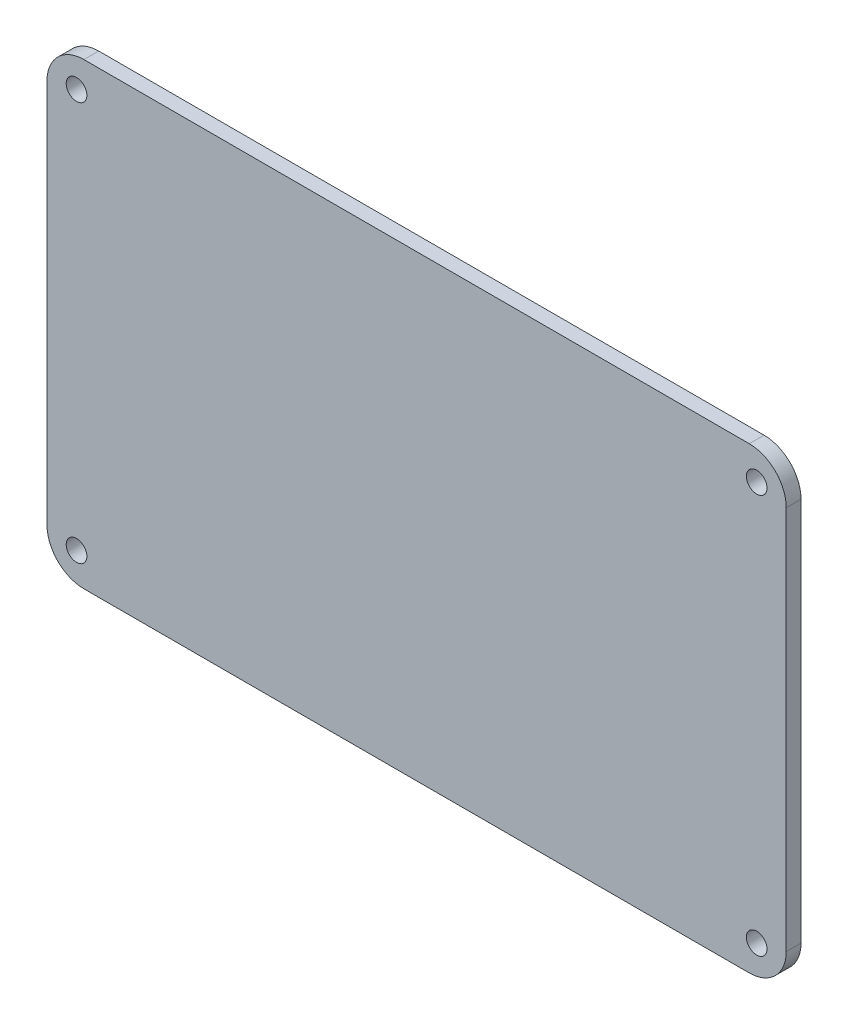
ISO-10303-21;
HEADER;
FILE_DESCRIPTION(('STEP AP214'),'2;1');
FILE_NAME('part.step','',(''),(''),'','','');
FILE_SCHEMA(('AUTOMOTIVE_DESIGN { 1 0 10303 214 1 1 1 1 }'));
ENDSEC;
DATA;
#1=APPLICATION_CONTEXT('core data for automotive mechanical design processes');
#2=APPLICATION_PROTOCOL_DEFINITION('international standard','automotive_design',2000,#1);
#3=PRODUCT_CONTEXT('',#1,'mechanical');
#4=PRODUCT('Part','Part','',(#3));
#5=PRODUCT_RELATED_PRODUCT_CATEGORY('part','',(#4));
#6=PRODUCT_DEFINITION_FORMATION('','',#4);
#7=PRODUCT_DEFINITION_CONTEXT('part definition',#1,'design');
#8=PRODUCT_DEFINITION('design','',#6,#7);
#9=PRODUCT_DEFINITION_SHAPE('','',#8);
#10=(LENGTH_UNIT() NAMED_UNIT(*) SI_UNIT(.MILLI.,.METRE.));
#11=(NAMED_UNIT(*) PLANE_ANGLE_UNIT() SI_UNIT($,.RADIAN.));
#12=(NAMED_UNIT(*) SI_UNIT($,.STERADIAN.) SOLID_ANGLE_UNIT());
#13=UNCERTAINTY_MEASURE_WITH_UNIT(LENGTH_MEASURE(1.E-05),#10,'distance_accuracy_value','');
#14=(GEOMETRIC_REPRESENTATION_CONTEXT(3) GLOBAL_UNCERTAINTY_ASSIGNED_CONTEXT((#13)) GLOBAL_UNIT_ASSIGNED_CONTEXT((#10,
#11,#12)) REPRESENTATION_CONTEXT('',''));
#15=CARTESIAN_POINT('',(0.,0.,0.));
#16=DIRECTION('',(0.,0.,1.));
#17=DIRECTION('',(1.,0.,0.));
#18=AXIS2_PLACEMENT_3D('',#15,#16,#17);
#19=CARTESIAN_POINT('',(0.,0.,2.));
#20=DIRECTION('',(0.,0.,-1.));
#21=DIRECTION('',(-1.,0.,0.));
#22=AXIS2_PLACEMENT_3D('',#19,#20,#21);
#23=PLANE('',#22);
#24=DIRECTION('',(0.,-1.,0.));
#25=VECTOR('',#24,1.);
#26=CARTESIAN_POINT('',(0.,0.,2.));
#27=LINE('',#26,#25);
#28=CARTESIAN_POINT('',(0.,57.,2.));
#29=VERTEX_POINT('',#28);
#30=CARTESIAN_POINT('',(0.,5.,2.));
#31=VERTEX_POINT('',#30);
#32=EDGE_CURVE('E143',#29,#31,#27,.T.);
#33=ORIENTED_EDGE('',*,*,#32,.T.);
#34=CARTESIAN_POINT('',(5.,5.,2.));
#35=DIRECTION('',(0.,0.,-1.));
#36=DIRECTION('',(-1.,0.,0.));
#37=AXIS2_PLACEMENT_3D('',#34,#35,#36);
#38=CIRCLE('',#37,5.);
#39=CARTESIAN_POINT('',(5.,0.,2.));
#40=VERTEX_POINT('',#39);
#41=EDGE_CURVE('E158',#31,#40,#38,.F.);
#42=ORIENTED_EDGE('',*,*,#41,.T.);
#43=DIRECTION('',(1.,0.,0.));
#44=VECTOR('',#43,1.);
#45=CARTESIAN_POINT('',(0.,0.,2.));
#46=LINE('',#45,#44);
#47=CARTESIAN_POINT('',(95.,0.,2.));
#48=VERTEX_POINT('',#47);
#49=EDGE_CURVE('E125',#40,#48,#46,.T.);
#50=ORIENTED_EDGE('',*,*,#49,.T.);
#51=CARTESIAN_POINT('',(95.,5.,2.));
#52=DIRECTION('',(0.,0.,-1.));
#53=DIRECTION('',(-1.,0.,0.));
#54=AXIS2_PLACEMENT_3D('',#51,#52,#53);
#55=CIRCLE('',#54,5.);
#56=CARTESIAN_POINT('',(100.,5.,2.));
#57=VERTEX_POINT('',#56);
#58=EDGE_CURVE('E156',#48,#57,#55,.F.);
#59=ORIENTED_EDGE('',*,*,#58,.T.);
#60=DIRECTION('',(0.,1.,0.));
#61=VECTOR('',#60,1.);
#62=CARTESIAN_POINT('',(100.,0.,2.));
#63=LINE('',#62,#61);
#64=CARTESIAN_POINT('',(100.,57.,2.));
#65=VERTEX_POINT('',#64);
#66=EDGE_CURVE('E169',#57,#65,#63,.T.);
#67=ORIENTED_EDGE('',*,*,#66,.T.);
#68=CARTESIAN_POINT('',(95.,57.,2.));
#69=DIRECTION('',(0.,0.,-1.));
#70=DIRECTION('',(-1.,0.,0.));
#71=AXIS2_PLACEMENT_3D('',#68,#69,#70);
#72=CIRCLE('',#71,5.);
#73=CARTESIAN_POINT('',(95.,62.,2.));
#74=VERTEX_POINT('',#73);
#75=EDGE_CURVE('E60',#65,#74,#72,.F.);
#76=ORIENTED_EDGE('',*,*,#75,.T.);
#77=DIRECTION('',(-1.,0.,0.));
#78=VECTOR('',#77,1.);
#79=CARTESIAN_POINT('',(0.,62.,2.));
#80=LINE('',#79,#78);
#81=CARTESIAN_POINT('',(5.,62.,2.));
#82=VERTEX_POINT('',#81);
#83=EDGE_CURVE('E144',#74,#82,#80,.T.);
#84=ORIENTED_EDGE('',*,*,#83,.T.);
#85=CARTESIAN_POINT('',(5.,57.,2.));
#86=DIRECTION('',(0.,0.,-1.));
#87=DIRECTION('',(-1.,0.,0.));
#88=AXIS2_PLACEMENT_3D('',#85,#86,#87);
#89=CIRCLE('',#88,5.);
#90=EDGE_CURVE('E153',#82,#29,#89,.F.);
#91=ORIENTED_EDGE('',*,*,#90,.T.);
#92=EDGE_LOOP('',(#33,#42,#50,#59,#67,#76,#84,#91));
#93=FACE_BOUND('',#92,.T.);
#94=CARTESIAN_POINT('',(4.,58.,2.));
#95=DIRECTION('',(0.,0.,1.));
#96=DIRECTION('',(1.,0.,0.));
#97=AXIS2_PLACEMENT_3D('',#94,#95,#96);
#98=CIRCLE('',#97,1.4);
#99=CARTESIAN_POINT('',(5.4,58.,2.));
#100=VERTEX_POINT('',#99);
#101=EDGE_CURVE('E138',#100,#100,#98,.T.);
#102=ORIENTED_EDGE('',*,*,#101,.F.);
#103=EDGE_LOOP('',(#102));
#104=FACE_BOUND('',#103,.T.);
#105=CARTESIAN_POINT('',(4.,4.,2.));
#106=DIRECTION('',(0.,0.,1.));
#107=DIRECTION('',(-1.,0.,0.));
#108=AXIS2_PLACEMENT_3D('',#105,#106,#107);
#109=CIRCLE('',#108,1.4);
#110=CARTESIAN_POINT('',(2.6,4.,2.));
#111=VERTEX_POINT('',#110);
#112=EDGE_CURVE('E186',#111,#111,#109,.T.);
#113=ORIENTED_EDGE('',*,*,#112,.F.);
#114=EDGE_LOOP('',(#113));
#115=FACE_BOUND('',#114,.T.);
#116=CARTESIAN_POINT('',(96.,4.,2.));
#117=DIRECTION('',(0.,0.,1.));
#118=DIRECTION('',(1.,0.,0.));
#119=AXIS2_PLACEMENT_3D('',#116,#117,#118);
#120=CIRCLE('',#119,1.39999999999999);
#121=CARTESIAN_POINT('',(97.4,4.,2.));
#122=VERTEX_POINT('',#121);
#123=EDGE_CURVE('E192',#122,#122,#120,.T.);
#124=ORIENTED_EDGE('',*,*,#123,.F.);
#125=EDGE_LOOP('',(#124));
#126=FACE_BOUND('',#125,.T.);
#127=CARTESIAN_POINT('',(96.,58.,2.));
#128=DIRECTION('',(0.,0.,1.));
#129=DIRECTION('',(-1.,0.,0.));
#130=AXIS2_PLACEMENT_3D('',#127,#128,#129);
#131=CIRCLE('',#130,1.39999999999999);
#132=CARTESIAN_POINT('',(94.6,58.,2.));
#133=VERTEX_POINT('',#132);
#134=EDGE_CURVE('E198',#133,#133,#131,.T.);
#135=ORIENTED_EDGE('',*,*,#134,.F.);
#136=EDGE_LOOP('',(#135));
#137=FACE_BOUND('',#136,.T.);
#138=ADVANCED_FACE('F39',(#93,#104,#115,#126,#137),#23,.F.);
#139=CARTESIAN_POINT('',(0.,0.,0.));
#140=DIRECTION('',(0.,0.,-1.));
#141=DIRECTION('',(-1.,0.,0.));
#142=AXIS2_PLACEMENT_3D('',#139,#140,#141);
#143=PLANE('',#142);
#144=CARTESIAN_POINT('',(96.,4.,0.));
#145=DIRECTION('',(0.,0.,1.));
#146=DIRECTION('',(1.,0.,0.));
#147=AXIS2_PLACEMENT_3D('',#144,#145,#146);
#148=CIRCLE('',#147,1.39999999999999);
#149=CARTESIAN_POINT('',(97.4,4.,0.));
#150=VERTEX_POINT('',#149);
#151=EDGE_CURVE('E195',#150,#150,#148,.T.);
#152=ORIENTED_EDGE('',*,*,#151,.T.);
#153=EDGE_LOOP('',(#152));
#154=FACE_BOUND('',#153,.T.);
#155=CARTESIAN_POINT('',(4.,58.,0.));
#156=DIRECTION('',(0.,0.,1.));
#157=DIRECTION('',(1.,0.,0.));
#158=AXIS2_PLACEMENT_3D('',#155,#156,#157);
#159=CIRCLE('',#158,1.4);
#160=CARTESIAN_POINT('',(5.4,58.,0.));
#161=VERTEX_POINT('',#160);
#162=EDGE_CURVE('E183',#161,#161,#159,.T.);
#163=ORIENTED_EDGE('',*,*,#162,.T.);
#164=EDGE_LOOP('',(#163));
#165=FACE_BOUND('',#164,.T.);
#166=DIRECTION('',(1.,0.,0.));
#167=VECTOR('',#166,1.);
#168=CARTESIAN_POINT('',(0.,0.,0.));
#169=LINE('',#168,#167);
#170=CARTESIAN_POINT('',(5.,0.,0.));
#171=VERTEX_POINT('',#170);
#172=CARTESIAN_POINT('',(95.,0.,0.));
#173=VERTEX_POINT('',#172);
#174=EDGE_CURVE('E122',#171,#173,#169,.T.);
#175=ORIENTED_EDGE('',*,*,#174,.F.);
#176=CARTESIAN_POINT('',(5.,5.,0.));
#177=DIRECTION('',(0.,0.,-1.));
#178=DIRECTION('',(-1.,0.,0.));
#179=AXIS2_PLACEMENT_3D('',#176,#177,#178);
#180=CIRCLE('',#179,5.);
#181=CARTESIAN_POINT('',(0.,5.,0.));
#182=VERTEX_POINT('',#181);
#183=EDGE_CURVE('E105',#171,#182,#180,.T.);
#184=ORIENTED_EDGE('',*,*,#183,.T.);
#185=DIRECTION('',(0.,-1.,0.));
#186=VECTOR('',#185,1.);
#187=CARTESIAN_POINT('',(0.,0.,0.));
#188=LINE('',#187,#186);
#189=CARTESIAN_POINT('',(0.,57.,0.));
#190=VERTEX_POINT('',#189);
#191=EDGE_CURVE('E133',#190,#182,#188,.T.);
#192=ORIENTED_EDGE('',*,*,#191,.F.);
#193=CARTESIAN_POINT('',(5.,57.,0.));
#194=DIRECTION('',(0.,0.,-1.));
#195=DIRECTION('',(-1.,0.,0.));
#196=AXIS2_PLACEMENT_3D('',#193,#194,#195);
#197=CIRCLE('',#196,5.);
#198=CARTESIAN_POINT('',(5.,62.,0.));
#199=VERTEX_POINT('',#198);
#200=EDGE_CURVE('E126',#190,#199,#197,.T.);
#201=ORIENTED_EDGE('',*,*,#200,.T.);
#202=DIRECTION('',(-1.,0.,0.));
#203=VECTOR('',#202,1.);
#204=CARTESIAN_POINT('',(0.,62.,0.));
#205=LINE('',#204,#203);
#206=CARTESIAN_POINT('',(95.,62.,0.));
#207=VERTEX_POINT('',#206);
#208=EDGE_CURVE('E136',#207,#199,#205,.T.);
#209=ORIENTED_EDGE('',*,*,#208,.F.);
#210=CARTESIAN_POINT('',(95.,57.,0.));
#211=DIRECTION('',(0.,0.,-1.));
#212=DIRECTION('',(-1.,0.,0.));
#213=AXIS2_PLACEMENT_3D('',#210,#211,#212);
#214=CIRCLE('',#213,5.);
#215=CARTESIAN_POINT('',(100.,57.,0.));
#216=VERTEX_POINT('',#215);
#217=EDGE_CURVE('E147',#207,#216,#214,.T.);
#218=ORIENTED_EDGE('',*,*,#217,.T.);
#219=DIRECTION('',(0.,1.,0.));
#220=VECTOR('',#219,1.);
#221=CARTESIAN_POINT('',(100.,0.,0.));
#222=LINE('',#221,#220);
#223=CARTESIAN_POINT('',(100.,5.,0.));
#224=VERTEX_POINT('',#223);
#225=EDGE_CURVE('E132',#224,#216,#222,.T.);
#226=ORIENTED_EDGE('',*,*,#225,.F.);
#227=CARTESIAN_POINT('',(95.,5.,0.));
#228=DIRECTION('',(0.,0.,-1.));
#229=DIRECTION('',(-1.,0.,0.));
#230=AXIS2_PLACEMENT_3D('',#227,#228,#229);
#231=CIRCLE('',#230,5.);
#232=EDGE_CURVE('E116',#224,#173,#231,.T.);
#233=ORIENTED_EDGE('',*,*,#232,.T.);
#234=EDGE_LOOP('',(#175,#184,#192,#201,#209,#218,#226,#233));
#235=FACE_BOUND('',#234,.T.);
#236=CARTESIAN_POINT('',(4.,4.,0.));
#237=DIRECTION('',(0.,0.,1.));
#238=DIRECTION('',(-1.,0.,0.));
#239=AXIS2_PLACEMENT_3D('',#236,#237,#238);
#240=CIRCLE('',#239,1.4);
#241=CARTESIAN_POINT('',(2.6,4.,0.));
#242=VERTEX_POINT('',#241);
#243=EDGE_CURVE('E189',#242,#242,#240,.T.);
#244=ORIENTED_EDGE('',*,*,#243,.T.);
#245=EDGE_LOOP('',(#244));
#246=FACE_BOUND('',#245,.T.);
#247=CARTESIAN_POINT('',(96.,58.,0.));
#248=DIRECTION('',(0.,0.,1.));
#249=DIRECTION('',(-1.,0.,0.));
#250=AXIS2_PLACEMENT_3D('',#247,#248,#249);
#251=CIRCLE('',#250,1.39999999999999);
#252=CARTESIAN_POINT('',(94.6,58.,0.));
#253=VERTEX_POINT('',#252);
#254=EDGE_CURVE('E201',#253,#253,#251,.T.);
#255=ORIENTED_EDGE('',*,*,#254,.T.);
#256=EDGE_LOOP('',(#255));
#257=FACE_BOUND('',#256,.T.);
#258=ADVANCED_FACE('F129',(#154,#165,#235,#246,#257),#143,.T.);
#259=CARTESIAN_POINT('',(0.,0.,2.));
#260=DIRECTION('',(1.,0.,0.));
#261=DIRECTION('',(0.,0.,-1.));
#262=AXIS2_PLACEMENT_3D('',#259,#260,#261);
#263=PLANE('',#262);
#264=ORIENTED_EDGE('',*,*,#191,.T.);
#265=DIRECTION('',(0.,0.,-1.));
#266=VECTOR('',#265,1.);
#267=CARTESIAN_POINT('',(0.,5.,2.));
#268=LINE('',#267,#266);
#269=EDGE_CURVE('E110',#182,#31,#268,.F.);
#270=ORIENTED_EDGE('',*,*,#269,.T.);
#271=ORIENTED_EDGE('',*,*,#32,.F.);
#272=DIRECTION('',(0.,0.,-1.));
#273=VECTOR('',#272,1.);
#274=CARTESIAN_POINT('',(0.,57.,2.));
#275=LINE('',#274,#273);
#276=EDGE_CURVE('E115',#29,#190,#275,.T.);
#277=ORIENTED_EDGE('',*,*,#276,.T.);
#278=EDGE_LOOP('',(#264,#270,#271,#277));
#279=FACE_BOUND('',#278,.T.);
#280=ADVANCED_FACE('F215',(#279),#263,.F.);
#281=CARTESIAN_POINT('',(0.,0.,2.));
#282=DIRECTION('',(0.,1.,0.));
#283=DIRECTION('',(0.,0.,1.));
#284=AXIS2_PLACEMENT_3D('',#281,#282,#283);
#285=PLANE('',#284);
#286=ORIENTED_EDGE('',*,*,#49,.F.);
#287=DIRECTION('',(0.,0.,-1.));
#288=VECTOR('',#287,1.);
#289=CARTESIAN_POINT('',(5.,0.,2.));
#290=LINE('',#289,#288);
#291=EDGE_CURVE('E109',#40,#171,#290,.T.);
#292=ORIENTED_EDGE('',*,*,#291,.T.);
#293=ORIENTED_EDGE('',*,*,#174,.T.);
#294=DIRECTION('',(0.,0.,-1.));
#295=VECTOR('',#294,1.);
#296=CARTESIAN_POINT('',(95.,0.,2.));
#297=LINE('',#296,#295);
#298=EDGE_CURVE('E127',#173,#48,#297,.F.);
#299=ORIENTED_EDGE('',*,*,#298,.T.);
#300=EDGE_LOOP('',(#286,#292,#293,#299));
#301=FACE_BOUND('',#300,.T.);
#302=ADVANCED_FACE('F121',(#301),#285,.F.);
#303=CARTESIAN_POINT('',(100.,0.,2.));
#304=DIRECTION('',(-1.,0.,0.));
#305=DIRECTION('',(0.,0.,1.));
#306=AXIS2_PLACEMENT_3D('',#303,#304,#305);
#307=PLANE('',#306);
#308=ORIENTED_EDGE('',*,*,#66,.F.);
#309=DIRECTION('',(0.,0.,-1.));
#310=VECTOR('',#309,1.);
#311=CARTESIAN_POINT('',(100.,5.,2.));
#312=LINE('',#311,#310);
#313=EDGE_CURVE('E162',#57,#224,#312,.T.);
#314=ORIENTED_EDGE('',*,*,#313,.T.);
#315=ORIENTED_EDGE('',*,*,#225,.T.);
#316=DIRECTION('',(0.,0.,-1.));
#317=VECTOR('',#316,1.);
#318=CARTESIAN_POINT('',(100.,57.,2.));
#319=LINE('',#318,#317);
#320=EDGE_CURVE('E160',#216,#65,#319,.F.);
#321=ORIENTED_EDGE('',*,*,#320,.T.);
#322=EDGE_LOOP('',(#308,#314,#315,#321));
#323=FACE_BOUND('',#322,.T.);
#324=ADVANCED_FACE('F167',(#323),#307,.F.);
#325=CARTESIAN_POINT('',(0.,62.,2.));
#326=DIRECTION('',(0.,-1.,0.));
#327=DIRECTION('',(0.,0.,-1.));
#328=AXIS2_PLACEMENT_3D('',#325,#326,#327);
#329=PLANE('',#328);
#330=ORIENTED_EDGE('',*,*,#83,.F.);
#331=DIRECTION('',(0.,0.,-1.));
#332=VECTOR('',#331,1.);
#333=CARTESIAN_POINT('',(95.,62.,2.));
#334=LINE('',#333,#332);
#335=EDGE_CURVE('E11',#74,#207,#334,.T.);
#336=ORIENTED_EDGE('',*,*,#335,.T.);
#337=ORIENTED_EDGE('',*,*,#208,.T.);
#338=DIRECTION('',(0.,0.,-1.));
#339=VECTOR('',#338,1.);
#340=CARTESIAN_POINT('',(5.,62.,2.));
#341=LINE('',#340,#339);
#342=EDGE_CURVE('E47',#199,#82,#341,.F.);
#343=ORIENTED_EDGE('',*,*,#342,.T.);
#344=EDGE_LOOP('',(#330,#336,#337,#343));
#345=FACE_BOUND('',#344,.T.);
#346=ADVANCED_FACE('F176',(#345),#329,.F.);
#347=CARTESIAN_POINT('',(4.,58.,2.));
#348=DIRECTION('',(0.,0.,-1.));
#349=DIRECTION('',(-1.,0.,0.));
#350=AXIS2_PLACEMENT_3D('',#347,#348,#349);
#351=CYLINDRICAL_SURFACE('',#350,1.4);
#352=ORIENTED_EDGE('',*,*,#101,.T.);
#353=EDGE_LOOP('',(#352));
#354=FACE_BOUND('',#353,.T.);
#355=ORIENTED_EDGE('',*,*,#162,.F.);
#356=EDGE_LOOP('',(#355));
#357=FACE_BOUND('',#356,.T.);
#358=ADVANCED_FACE('F220',(#354,#357),#351,.F.);
#359=CARTESIAN_POINT('',(4.,4.,2.));
#360=DIRECTION('',(0.,0.,-1.));
#361=DIRECTION('',(-1.,0.,0.));
#362=AXIS2_PLACEMENT_3D('',#359,#360,#361);
#363=CYLINDRICAL_SURFACE('',#362,1.4);
#364=ORIENTED_EDGE('',*,*,#112,.T.);
#365=EDGE_LOOP('',(#364));
#366=FACE_BOUND('',#365,.T.);
#367=ORIENTED_EDGE('',*,*,#243,.F.);
#368=EDGE_LOOP('',(#367));
#369=FACE_BOUND('',#368,.T.);
#370=ADVANCED_FACE('F326',(#366,#369),#363,.F.);
#371=CARTESIAN_POINT('',(96.,4.,2.));
#372=DIRECTION('',(0.,0.,-1.));
#373=DIRECTION('',(-1.,0.,0.));
#374=AXIS2_PLACEMENT_3D('',#371,#372,#373);
#375=CYLINDRICAL_SURFACE('',#374,1.39999999999999);
#376=ORIENTED_EDGE('',*,*,#123,.T.);
#377=EDGE_LOOP('',(#376));
#378=FACE_BOUND('',#377,.T.);
#379=ORIENTED_EDGE('',*,*,#151,.F.);
#380=EDGE_LOOP('',(#379));
#381=FACE_BOUND('',#380,.T.);
#382=ADVANCED_FACE('F316',(#378,#381),#375,.F.);
#383=CARTESIAN_POINT('',(96.,58.,2.));
#384=DIRECTION('',(0.,0.,-1.));
#385=DIRECTION('',(-1.,0.,0.));
#386=AXIS2_PLACEMENT_3D('',#383,#384,#385);
#387=CYLINDRICAL_SURFACE('',#386,1.39999999999999);
#388=ORIENTED_EDGE('',*,*,#134,.T.);
#389=EDGE_LOOP('',(#388));
#390=FACE_BOUND('',#389,.T.);
#391=ORIENTED_EDGE('',*,*,#254,.F.);
#392=EDGE_LOOP('',(#391));
#393=FACE_BOUND('',#392,.T.);
#394=ADVANCED_FACE('F207',(#390,#393),#387,.F.);
#395=CARTESIAN_POINT('',(5.,5.,2.));
#396=DIRECTION('',(0.,0.,-1.));
#397=DIRECTION('',(-1.,0.,0.));
#398=AXIS2_PLACEMENT_3D('',#395,#396,#397);
#399=CYLINDRICAL_SURFACE('',#398,5.);
#400=ORIENTED_EDGE('',*,*,#41,.F.);
#401=ORIENTED_EDGE('',*,*,#269,.F.);
#402=ORIENTED_EDGE('',*,*,#183,.F.);
#403=ORIENTED_EDGE('',*,*,#291,.F.);
#404=EDGE_LOOP('',(#400,#401,#402,#403));
#405=FACE_BOUND('',#404,.T.);
#406=ADVANCED_FACE('F108',(#405),#399,.T.);
#407=CARTESIAN_POINT('',(95.,5.,2.));
#408=DIRECTION('',(0.,0.,-1.));
#409=DIRECTION('',(-1.,0.,0.));
#410=AXIS2_PLACEMENT_3D('',#407,#408,#409);
#411=CYLINDRICAL_SURFACE('',#410,5.);
#412=ORIENTED_EDGE('',*,*,#58,.F.);
#413=ORIENTED_EDGE('',*,*,#298,.F.);
#414=ORIENTED_EDGE('',*,*,#232,.F.);
#415=ORIENTED_EDGE('',*,*,#313,.F.);
#416=EDGE_LOOP('',(#412,#413,#414,#415));
#417=FACE_BOUND('',#416,.T.);
#418=ADVANCED_FACE('F234',(#417),#411,.T.);
#419=CARTESIAN_POINT('',(95.,57.,2.));
#420=DIRECTION('',(0.,0.,-1.));
#421=DIRECTION('',(-1.,0.,0.));
#422=AXIS2_PLACEMENT_3D('',#419,#420,#421);
#423=CYLINDRICAL_SURFACE('',#422,5.);
#424=ORIENTED_EDGE('',*,*,#75,.F.);
#425=ORIENTED_EDGE('',*,*,#320,.F.);
#426=ORIENTED_EDGE('',*,*,#217,.F.);
#427=ORIENTED_EDGE('',*,*,#335,.F.);
#428=EDGE_LOOP('',(#424,#425,#426,#427));
#429=FACE_BOUND('',#428,.T.);
#430=ADVANCED_FACE('F175',(#429),#423,.T.);
#431=CARTESIAN_POINT('',(5.,57.,2.));
#432=DIRECTION('',(0.,0.,-1.));
#433=DIRECTION('',(-1.,0.,0.));
#434=AXIS2_PLACEMENT_3D('',#431,#432,#433);
#435=CYLINDRICAL_SURFACE('',#434,5.);
#436=ORIENTED_EDGE('',*,*,#90,.F.);
#437=ORIENTED_EDGE('',*,*,#342,.F.);
#438=ORIENTED_EDGE('',*,*,#200,.F.);
#439=ORIENTED_EDGE('',*,*,#276,.F.);
#440=EDGE_LOOP('',(#436,#437,#438,#439));
#441=FACE_BOUND('',#440,.T.);
#442=ADVANCED_FACE('F41',(#441),#435,.T.);
#443=CLOSED_SHELL('',(#138,#258,#280,#302,#324,#346,#358,#370,#382,#394,#406,#418,#430,#442));
#444=MANIFOLD_SOLID_BREP('B2',#443);
#445=ADVANCED_BREP_SHAPE_REPRESENTATION('',(#18,#444),#14);
#446=SHAPE_DEFINITION_REPRESENTATION(#9,#445);
ENDSEC;
END-ISO-10303-21;
